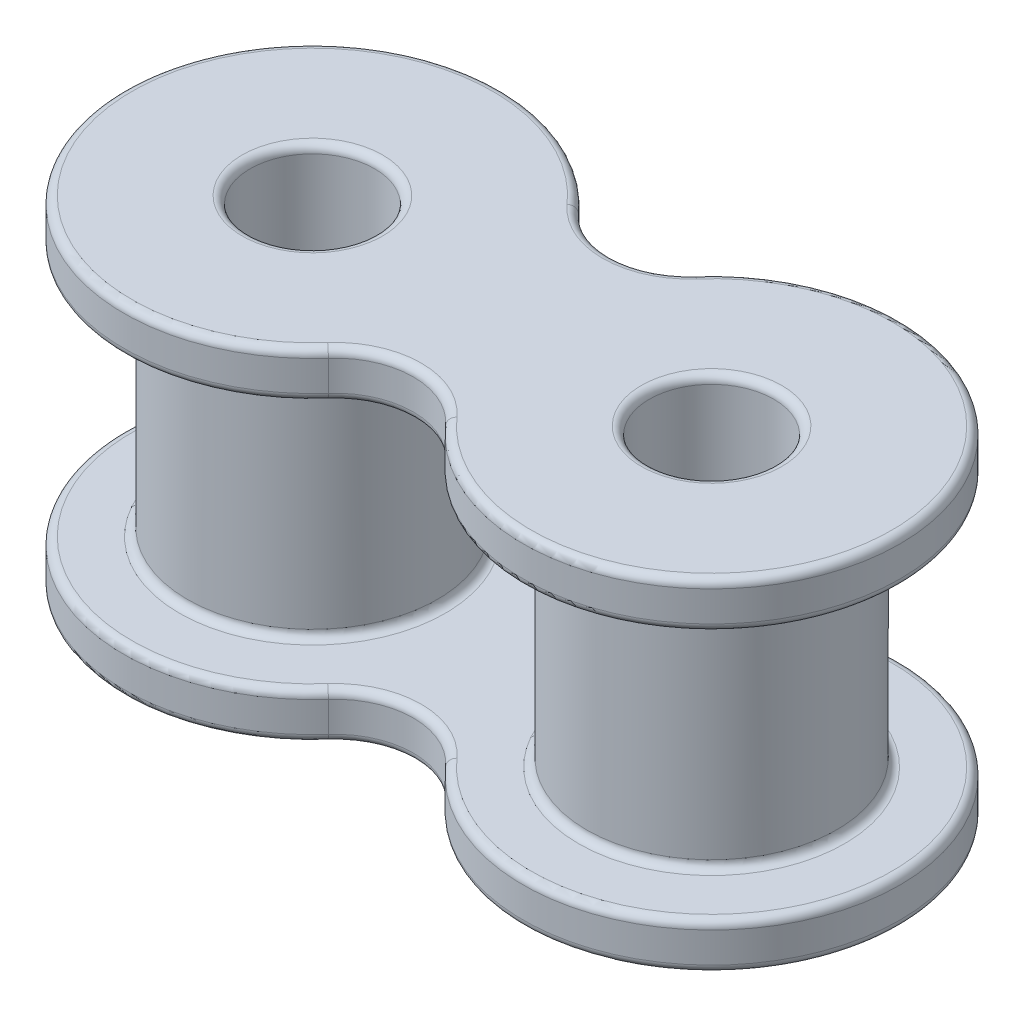
ISO-10303-21;
HEADER;
FILE_DESCRIPTION(('STEP AP214'),'2;1');
FILE_NAME('part.step','',(''),(''),'','','');
FILE_SCHEMA(('AUTOMOTIVE_DESIGN { 1 0 10303 214 1 1 1 1 }'));
ENDSEC;
DATA;
#1=APPLICATION_CONTEXT('core data for automotive mechanical design processes');
#2=APPLICATION_PROTOCOL_DEFINITION('international standard','automotive_design',2000,#1);
#3=PRODUCT_CONTEXT('',#1,'mechanical');
#4=PRODUCT('Part','Part','',(#3));
#5=PRODUCT_RELATED_PRODUCT_CATEGORY('part','',(#4));
#6=PRODUCT_DEFINITION_FORMATION('','',#4);
#7=PRODUCT_DEFINITION_CONTEXT('part definition',#1,'design');
#8=PRODUCT_DEFINITION('design','',#6,#7);
#9=PRODUCT_DEFINITION_SHAPE('','',#8);
#10=(LENGTH_UNIT() NAMED_UNIT(*) SI_UNIT(.MILLI.,.METRE.));
#11=(NAMED_UNIT(*) PLANE_ANGLE_UNIT() SI_UNIT($,.RADIAN.));
#12=(NAMED_UNIT(*) SI_UNIT($,.STERADIAN.) SOLID_ANGLE_UNIT());
#13=UNCERTAINTY_MEASURE_WITH_UNIT(LENGTH_MEASURE(1.E-05),#10,'distance_accuracy_value','');
#14=(GEOMETRIC_REPRESENTATION_CONTEXT(3) GLOBAL_UNCERTAINTY_ASSIGNED_CONTEXT((#13)) GLOBAL_UNIT_ASSIGNED_CONTEXT((#10,
#11,#12)) REPRESENTATION_CONTEXT('',''));
#15=CARTESIAN_POINT('',(0.,0.,0.));
#16=DIRECTION('',(0.,0.,1.));
#17=DIRECTION('',(1.,0.,0.));
#18=AXIS2_PLACEMENT_3D('',#15,#16,#17);
#19=CARTESIAN_POINT('',(3.175,0.7366,-2.81610900547326));
#20=DIRECTION('',(0.,1.,0.));
#21=DIRECTION('',(0.,0.,1.));
#22=AXIS2_PLACEMENT_3D('',#19,#20,#21);
#23=PLANE('',#22);
#24=CARTESIAN_POINT('',(-6.35,0.7366,0.));
#25=DIRECTION('',(0.,1.,0.));
#26=DIRECTION('',(0.,0.,1.));
#27=AXIS2_PLACEMENT_3D('',#24,#25,#26);
#28=CIRCLE('',#27,4.2291);
#29=CARTESIAN_POINT('',(-6.35,0.7366,4.2291));
#30=VERTEX_POINT('',#29);
#31=EDGE_CURVE('E183',#30,#30,#28,.F.);
#32=ORIENTED_EDGE('',*,*,#31,.T.);
#33=EDGE_LOOP('',(#32));
#34=FACE_BOUND('',#33,.T.);
#35=CARTESIAN_POINT('',(6.35,0.7366,0.));
#36=DIRECTION('',(0.,1.,0.));
#37=DIRECTION('',(0.,0.,1.));
#38=AXIS2_PLACEMENT_3D('',#35,#36,#37);
#39=CIRCLE('',#38,4.2291);
#40=CARTESIAN_POINT('',(6.35,0.7366,4.2291));
#41=VERTEX_POINT('',#40);
#42=EDGE_CURVE('E180',#41,#41,#39,.F.);
#43=ORIENTED_EDGE('',*,*,#42,.T.);
#44=EDGE_LOOP('',(#43));
#45=FACE_BOUND('',#44,.T.);
#46=CARTESIAN_POINT('',(6.35,0.7366,0.));
#47=DIRECTION('',(0.,1.,0.));
#48=DIRECTION('',(0.,0.,1.));
#49=AXIS2_PLACEMENT_3D('',#46,#47,#48);
#50=CIRCLE('',#49,5.7404);
#51=CARTESIAN_POINT('',(2.05546815225198,0.7366,3.80909285377477));
#52=VERTEX_POINT('',#51);
#53=CARTESIAN_POINT('',(2.05546815225198,0.7366,-3.80909285377477));
#54=VERTEX_POINT('',#53);
#55=EDGE_CURVE('E178',#52,#54,#50,.T.);
#56=ORIENTED_EDGE('',*,*,#55,.T.);
#57=CARTESIAN_POINT('',(0.,0.7366,-5.63221801094651));
#58=DIRECTION('',(0.,1.,0.));
#59=DIRECTION('',(0.,0.,1.));
#60=AXIS2_PLACEMENT_3D('',#57,#58,#59);
#61=CIRCLE('',#60,2.74749607163225);
#62=CARTESIAN_POINT('',(-2.05546815225198,0.7366,-3.80909285377477));
#63=VERTEX_POINT('',#62);
#64=EDGE_CURVE('E159',#54,#63,#61,.F.);
#65=ORIENTED_EDGE('',*,*,#64,.T.);
#66=CARTESIAN_POINT('',(-6.35,0.7366,0.));
#67=DIRECTION('',(0.,1.,0.));
#68=DIRECTION('',(0.,0.,1.));
#69=AXIS2_PLACEMENT_3D('',#66,#67,#68);
#70=CIRCLE('',#69,5.7404);
#71=CARTESIAN_POINT('',(-2.05546815225198,0.7366,3.80909285377477));
#72=VERTEX_POINT('',#71);
#73=EDGE_CURVE('E168',#63,#72,#70,.T.);
#74=ORIENTED_EDGE('',*,*,#73,.T.);
#75=CARTESIAN_POINT('',(0.,0.7366,5.63221801094651));
#76=DIRECTION('',(0.,1.,0.));
#77=DIRECTION('',(0.,0.,1.));
#78=AXIS2_PLACEMENT_3D('',#75,#76,#77);
#79=CIRCLE('',#78,2.74749607163225);
#80=EDGE_CURVE('E174',#72,#52,#79,.F.);
#81=ORIENTED_EDGE('',*,*,#80,.T.);
#82=EDGE_LOOP('',(#56,#65,#74,#81));
#83=FACE_BOUND('',#82,.T.);
#84=ADVANCED_FACE('F36',(#34,#45,#83),#23,.T.);
#85=CARTESIAN_POINT('',(3.175,-0.7366,-2.81610900547326));
#86=DIRECTION('',(0.,1.,0.));
#87=DIRECTION('',(0.,0.,1.));
#88=AXIS2_PLACEMENT_3D('',#85,#86,#87);
#89=PLANE('',#88);
#90=CARTESIAN_POINT('',(6.35,-0.7366,0.));
#91=DIRECTION('',(0.,1.,0.));
#92=DIRECTION('',(0.,0.,1.));
#93=AXIS2_PLACEMENT_3D('',#90,#91,#92);
#94=CIRCLE('',#93,2.2352);
#95=CARTESIAN_POINT('',(6.35,-0.7366,2.2352));
#96=VERTEX_POINT('',#95);
#97=EDGE_CURVE('E218',#96,#96,#94,.T.);
#98=ORIENTED_EDGE('',*,*,#97,.T.);
#99=EDGE_LOOP('',(#98));
#100=FACE_BOUND('',#99,.T.);
#101=CARTESIAN_POINT('',(-6.35,-0.7366,0.));
#102=DIRECTION('',(0.,1.,0.));
#103=DIRECTION('',(0.,0.,1.));
#104=AXIS2_PLACEMENT_3D('',#101,#102,#103);
#105=CIRCLE('',#104,2.2352);
#106=CARTESIAN_POINT('',(-6.35,-0.7366,2.2352));
#107=VERTEX_POINT('',#106);
#108=EDGE_CURVE('E215',#107,#107,#105,.T.);
#109=ORIENTED_EDGE('',*,*,#108,.T.);
#110=EDGE_LOOP('',(#109));
#111=FACE_BOUND('',#110,.T.);
#112=CARTESIAN_POINT('',(0.,-0.7366,5.63221801094651));
#113=DIRECTION('',(0.,1.,0.));
#114=DIRECTION('',(0.,0.,1.));
#115=AXIS2_PLACEMENT_3D('',#112,#113,#114);
#116=CIRCLE('',#115,2.74749607163225);
#117=CARTESIAN_POINT('',(2.05546815225198,-0.7366,3.80909285377476));
#118=VERTEX_POINT('',#117);
#119=CARTESIAN_POINT('',(-2.05546815225198,-0.7366,3.80909285377476));
#120=VERTEX_POINT('',#119);
#121=EDGE_CURVE('E208',#118,#120,#116,.T.);
#122=ORIENTED_EDGE('',*,*,#121,.T.);
#123=CARTESIAN_POINT('',(-6.35,-0.7366,0.));
#124=DIRECTION('',(0.,1.,0.));
#125=DIRECTION('',(0.,0.,1.));
#126=AXIS2_PLACEMENT_3D('',#123,#124,#125);
#127=CIRCLE('',#126,5.7404);
#128=CARTESIAN_POINT('',(-2.05546815225198,-0.7366,-3.80909285377477));
#129=VERTEX_POINT('',#128);
#130=EDGE_CURVE('E212',#120,#129,#127,.F.);
#131=ORIENTED_EDGE('',*,*,#130,.T.);
#132=CARTESIAN_POINT('',(0.,-0.7366,-5.63221801094651));
#133=DIRECTION('',(0.,1.,0.));
#134=DIRECTION('',(0.,0.,1.));
#135=AXIS2_PLACEMENT_3D('',#132,#133,#134);
#136=CIRCLE('',#135,2.74749607163225);
#137=CARTESIAN_POINT('',(2.05546815225198,-0.7366,-3.80909285377477));
#138=VERTEX_POINT('',#137);
#139=EDGE_CURVE('E210',#129,#138,#136,.T.);
#140=ORIENTED_EDGE('',*,*,#139,.T.);
#141=CARTESIAN_POINT('',(6.35,-0.7366,0.));
#142=DIRECTION('',(0.,1.,0.));
#143=DIRECTION('',(0.,0.,1.));
#144=AXIS2_PLACEMENT_3D('',#141,#142,#143);
#145=CIRCLE('',#144,5.7404);
#146=EDGE_CURVE('E206',#138,#118,#145,.F.);
#147=ORIENTED_EDGE('',*,*,#146,.T.);
#148=EDGE_LOOP('',(#122,#131,#140,#147));
#149=FACE_BOUND('',#148,.T.);
#150=ADVANCED_FACE('F386',(#100,#111,#149),#89,.F.);
#151=CARTESIAN_POINT('',(0.,0.7366,-5.63221801094651));
#152=DIRECTION('',(0.,-1.,0.));
#153=DIRECTION('',(0.,0.,-1.));
#154=AXIS2_PLACEMENT_3D('',#151,#152,#153);
#155=CYLINDRICAL_SURFACE('',#154,2.49349607163225);
#156=DIRECTION('',(0.,-1.,0.));
#157=VECTOR('',#156,1.);
#158=CARTESIAN_POINT('',(-1.86544461916579,0.7366,-3.97763678535772));
#159=LINE('',#158,#157);
#160=CARTESIAN_POINT('',(-1.86544461916579,0.4826,-3.97763678535772));
#161=VERTEX_POINT('',#160);
#162=CARTESIAN_POINT('',(-1.86544461916579,-0.4826,-3.97763678535772));
#163=VERTEX_POINT('',#162);
#164=EDGE_CURVE('E175',#161,#163,#159,.T.);
#165=ORIENTED_EDGE('',*,*,#164,.F.);
#166=CARTESIAN_POINT('',(0.,0.4826,-5.63221801094651));
#167=DIRECTION('',(0.,1.,0.));
#168=DIRECTION('',(0.,0.,1.));
#169=AXIS2_PLACEMENT_3D('',#166,#167,#168);
#170=CIRCLE('',#169,2.49349607163225);
#171=CARTESIAN_POINT('',(1.86544461916579,0.4826,-3.97763678535772));
#172=VERTEX_POINT('',#171);
#173=EDGE_CURVE('E161',#161,#172,#170,.T.);
#174=ORIENTED_EDGE('',*,*,#173,.T.);
#175=DIRECTION('',(0.,-1.,0.));
#176=VECTOR('',#175,1.);
#177=CARTESIAN_POINT('',(1.86544461916579,0.7366,-3.97763678535772));
#178=LINE('',#177,#176);
#179=CARTESIAN_POINT('',(1.86544461916579,-0.4826,-3.97763678535772));
#180=VERTEX_POINT('',#179);
#181=EDGE_CURVE('E239',#172,#180,#178,.T.);
#182=ORIENTED_EDGE('',*,*,#181,.T.);
#183=CARTESIAN_POINT('',(0.,-0.4826,-5.63221801094651));
#184=DIRECTION('',(0.,1.,0.));
#185=DIRECTION('',(0.,0.,1.));
#186=AXIS2_PLACEMENT_3D('',#183,#184,#185);
#187=CIRCLE('',#186,2.49349607163225);
#188=EDGE_CURVE('E190',#180,#163,#187,.F.);
#189=ORIENTED_EDGE('',*,*,#188,.T.);
#190=EDGE_LOOP('',(#165,#174,#182,#189));
#191=FACE_BOUND('',#190,.T.);
#192=ADVANCED_FACE('F370',(#191),#155,.F.);
#193=CARTESIAN_POINT('',(-6.35,0.7366,0.));
#194=DIRECTION('',(0.,-1.,0.));
#195=DIRECTION('',(0.,0.,-1.));
#196=AXIS2_PLACEMENT_3D('',#193,#194,#195);
#197=CYLINDRICAL_SURFACE('',#196,5.9944);
#198=ORIENTED_EDGE('',*,*,#164,.T.);
#199=CARTESIAN_POINT('',(-6.35,-0.4826,0.));
#200=DIRECTION('',(0.,1.,0.));
#201=DIRECTION('',(0.,0.,1.));
#202=AXIS2_PLACEMENT_3D('',#199,#200,#201);
#203=CIRCLE('',#202,5.9944);
#204=CARTESIAN_POINT('',(-1.86544461916578,-0.4826,3.97763678535772));
#205=VERTEX_POINT('',#204);
#206=EDGE_CURVE('E203',#163,#205,#203,.T.);
#207=ORIENTED_EDGE('',*,*,#206,.T.);
#208=DIRECTION('',(0.,-1.,0.));
#209=VECTOR('',#208,1.);
#210=CARTESIAN_POINT('',(-1.86544461916578,0.7366,3.97763678535772));
#211=LINE('',#210,#209);
#212=CARTESIAN_POINT('',(-1.86544461916578,0.4826,3.97763678535772));
#213=VERTEX_POINT('',#212);
#214=EDGE_CURVE('E354',#213,#205,#211,.T.);
#215=ORIENTED_EDGE('',*,*,#214,.F.);
#216=CARTESIAN_POINT('',(-6.35,0.4826,0.));
#217=DIRECTION('',(0.,1.,0.));
#218=DIRECTION('',(0.,0.,1.));
#219=AXIS2_PLACEMENT_3D('',#216,#217,#218);
#220=CIRCLE('',#219,5.9944);
#221=EDGE_CURVE('E201',#213,#161,#220,.F.);
#222=ORIENTED_EDGE('',*,*,#221,.T.);
#223=EDGE_LOOP('',(#198,#207,#215,#222));
#224=FACE_BOUND('',#223,.T.);
#225=ADVANCED_FACE('F395',(#224),#197,.T.);
#226=CARTESIAN_POINT('',(0.,0.7366,5.63221801094651));
#227=DIRECTION('',(0.,-1.,0.));
#228=DIRECTION('',(0.,0.,-1.));
#229=AXIS2_PLACEMENT_3D('',#226,#227,#228);
#230=CYLINDRICAL_SURFACE('',#229,2.49349607163225);
#231=DIRECTION('',(0.,-1.,0.));
#232=VECTOR('',#231,1.);
#233=CARTESIAN_POINT('',(1.86544461916579,0.7366,3.97763678535772));
#234=LINE('',#233,#232);
#235=CARTESIAN_POINT('',(1.86544461916579,0.4826,3.97763678535772));
#236=VERTEX_POINT('',#235);
#237=CARTESIAN_POINT('',(1.86544461916579,-0.4826,3.97763678535772));
#238=VERTEX_POINT('',#237);
#239=EDGE_CURVE('E351',#236,#238,#234,.T.);
#240=ORIENTED_EDGE('',*,*,#239,.F.);
#241=CARTESIAN_POINT('',(0.,0.4826,5.63221801094651));
#242=DIRECTION('',(0.,1.,0.));
#243=DIRECTION('',(0.,0.,1.));
#244=AXIS2_PLACEMENT_3D('',#241,#242,#243);
#245=CIRCLE('',#244,2.49349607163225);
#246=EDGE_CURVE('E199',#236,#213,#245,.T.);
#247=ORIENTED_EDGE('',*,*,#246,.T.);
#248=ORIENTED_EDGE('',*,*,#214,.T.);
#249=CARTESIAN_POINT('',(0.,-0.4826,5.63221801094651));
#250=DIRECTION('',(0.,1.,0.));
#251=DIRECTION('',(0.,0.,1.));
#252=AXIS2_PLACEMENT_3D('',#249,#250,#251);
#253=CIRCLE('',#252,2.49349607163225);
#254=EDGE_CURVE('E197',#205,#238,#253,.F.);
#255=ORIENTED_EDGE('',*,*,#254,.T.);
#256=EDGE_LOOP('',(#240,#247,#248,#255));
#257=FACE_BOUND('',#256,.T.);
#258=ADVANCED_FACE('F398',(#257),#230,.F.);
#259=CARTESIAN_POINT('',(6.35,0.7366,0.));
#260=DIRECTION('',(0.,-1.,0.));
#261=DIRECTION('',(0.,0.,-1.));
#262=AXIS2_PLACEMENT_3D('',#259,#260,#261);
#263=CYLINDRICAL_SURFACE('',#262,5.9944);
#264=ORIENTED_EDGE('',*,*,#181,.F.);
#265=CARTESIAN_POINT('',(6.35,0.4826,0.));
#266=DIRECTION('',(0.,1.,0.));
#267=DIRECTION('',(0.,0.,1.));
#268=AXIS2_PLACEMENT_3D('',#265,#266,#267);
#269=CIRCLE('',#268,5.9944);
#270=EDGE_CURVE('E195',#172,#236,#269,.F.);
#271=ORIENTED_EDGE('',*,*,#270,.T.);
#272=ORIENTED_EDGE('',*,*,#239,.T.);
#273=CARTESIAN_POINT('',(6.35,-0.4826,0.));
#274=DIRECTION('',(0.,1.,0.));
#275=DIRECTION('',(0.,0.,1.));
#276=AXIS2_PLACEMENT_3D('',#273,#274,#275);
#277=CIRCLE('',#276,5.9944);
#278=EDGE_CURVE('E193',#238,#180,#277,.T.);
#279=ORIENTED_EDGE('',*,*,#278,.T.);
#280=EDGE_LOOP('',(#264,#271,#272,#279));
#281=FACE_BOUND('',#280,.T.);
#282=ADVANCED_FACE('F372',(#281),#263,.T.);
#283=CARTESIAN_POINT('',(-6.35,0.7366,0.));
#284=DIRECTION('',(0.,-1.,0.));
#285=DIRECTION('',(0.,0.,-1.));
#286=AXIS2_PLACEMENT_3D('',#283,#284,#285);
#287=CYLINDRICAL_SURFACE('',#286,1.9812);
#288=CARTESIAN_POINT('',(-6.35,9.8806,0.));
#289=DIRECTION('',(0.,-1.,0.));
#290=DIRECTION('',(0.,0.,-1.));
#291=AXIS2_PLACEMENT_3D('',#288,#289,#290);
#292=CIRCLE('',#291,1.9812);
#293=CARTESIAN_POINT('',(-6.35,9.8806,-1.9812));
#294=VERTEX_POINT('',#293);
#295=EDGE_CURVE('E11',#294,#294,#292,.F.);
#296=ORIENTED_EDGE('',*,*,#295,.T.);
#297=EDGE_LOOP('',(#296));
#298=FACE_BOUND('',#297,.T.);
#299=CARTESIAN_POINT('',(-6.35,-0.4826,0.));
#300=DIRECTION('',(0.,1.,0.));
#301=DIRECTION('',(0.,0.,1.));
#302=AXIS2_PLACEMENT_3D('',#299,#300,#301);
#303=CIRCLE('',#302,1.9812);
#304=CARTESIAN_POINT('',(-6.35,-0.4826,1.9812));
#305=VERTEX_POINT('',#304);
#306=EDGE_CURVE('E230',#305,#305,#303,.F.);
#307=ORIENTED_EDGE('',*,*,#306,.T.);
#308=EDGE_LOOP('',(#307));
#309=FACE_BOUND('',#308,.T.);
#310=ADVANCED_FACE('F405',(#298,#309),#287,.F.);
#311=CARTESIAN_POINT('',(6.35,0.7366,0.));
#312=DIRECTION('',(0.,-1.,0.));
#313=DIRECTION('',(0.,0.,-1.));
#314=AXIS2_PLACEMENT_3D('',#311,#312,#313);
#315=CYLINDRICAL_SURFACE('',#314,1.9812);
#316=CARTESIAN_POINT('',(6.35,9.8806,0.));
#317=DIRECTION('',(0.,-1.,0.));
#318=DIRECTION('',(0.,0.,-1.));
#319=AXIS2_PLACEMENT_3D('',#316,#317,#318);
#320=CIRCLE('',#319,1.9812);
#321=CARTESIAN_POINT('',(6.35,9.8806,-1.9812));
#322=VERTEX_POINT('',#321);
#323=EDGE_CURVE('E45',#322,#322,#320,.F.);
#324=ORIENTED_EDGE('',*,*,#323,.T.);
#325=EDGE_LOOP('',(#324));
#326=FACE_BOUND('',#325,.T.);
#327=CARTESIAN_POINT('',(6.35,-0.4826,0.));
#328=DIRECTION('',(0.,1.,0.));
#329=DIRECTION('',(0.,0.,1.));
#330=AXIS2_PLACEMENT_3D('',#327,#328,#329);
#331=CIRCLE('',#330,1.9812);
#332=CARTESIAN_POINT('',(6.35,-0.4826,1.9812));
#333=VERTEX_POINT('',#332);
#334=EDGE_CURVE('E227',#333,#333,#331,.F.);
#335=ORIENTED_EDGE('',*,*,#334,.T.);
#336=EDGE_LOOP('',(#335));
#337=FACE_BOUND('',#336,.T.);
#338=ADVANCED_FACE('F420',(#326,#337),#315,.F.);
#339=CARTESIAN_POINT('',(6.35,8.6614,0.));
#340=DIRECTION('',(0.,-1.,0.));
#341=DIRECTION('',(0.,0.,-1.));
#342=AXIS2_PLACEMENT_3D('',#339,#340,#341);
#343=CYLINDRICAL_SURFACE('',#342,3.9751);
#344=CARTESIAN_POINT('',(6.35,8.4074,0.));
#345=DIRECTION('',(0.,-1.,0.));
#346=DIRECTION('',(0.,0.,-1.));
#347=AXIS2_PLACEMENT_3D('',#344,#345,#346);
#348=CIRCLE('',#347,3.9751);
#349=CARTESIAN_POINT('',(6.35,8.4074,-3.9751));
#350=VERTEX_POINT('',#349);
#351=EDGE_CURVE('E298',#350,#350,#348,.T.);
#352=ORIENTED_EDGE('',*,*,#351,.T.);
#353=EDGE_LOOP('',(#352));
#354=FACE_BOUND('',#353,.T.);
#355=CARTESIAN_POINT('',(6.35,0.990599999999999,0.));
#356=DIRECTION('',(0.,1.,0.));
#357=DIRECTION('',(0.,0.,1.));
#358=AXIS2_PLACEMENT_3D('',#355,#356,#357);
#359=CIRCLE('',#358,3.9751);
#360=CARTESIAN_POINT('',(6.35,0.990599999999999,3.9751));
#361=VERTEX_POINT('',#360);
#362=EDGE_CURVE('E224',#361,#361,#359,.T.);
#363=ORIENTED_EDGE('',*,*,#362,.T.);
#364=EDGE_LOOP('',(#363));
#365=FACE_BOUND('',#364,.T.);
#366=ADVANCED_FACE('F424',(#354,#365),#343,.T.);
#367=CARTESIAN_POINT('',(-6.35,8.6614,0.));
#368=DIRECTION('',(0.,-1.,0.));
#369=DIRECTION('',(0.,0.,-1.));
#370=AXIS2_PLACEMENT_3D('',#367,#368,#369);
#371=CYLINDRICAL_SURFACE('',#370,3.9751);
#372=CARTESIAN_POINT('',(-6.35,8.4074,0.));
#373=DIRECTION('',(0.,-1.,0.));
#374=DIRECTION('',(0.,0.,-1.));
#375=AXIS2_PLACEMENT_3D('',#372,#373,#374);
#376=CIRCLE('',#375,3.9751);
#377=CARTESIAN_POINT('',(-6.35,8.4074,-3.9751));
#378=VERTEX_POINT('',#377);
#379=EDGE_CURVE('E295',#378,#378,#376,.T.);
#380=ORIENTED_EDGE('',*,*,#379,.T.);
#381=EDGE_LOOP('',(#380));
#382=FACE_BOUND('',#381,.T.);
#383=CARTESIAN_POINT('',(-6.35,0.990599999999999,0.));
#384=DIRECTION('',(0.,1.,0.));
#385=DIRECTION('',(0.,0.,1.));
#386=AXIS2_PLACEMENT_3D('',#383,#384,#385);
#387=CIRCLE('',#386,3.9751);
#388=CARTESIAN_POINT('',(-6.35,0.990599999999999,3.9751));
#389=VERTEX_POINT('',#388);
#390=EDGE_CURVE('E221',#389,#389,#387,.T.);
#391=ORIENTED_EDGE('',*,*,#390,.T.);
#392=EDGE_LOOP('',(#391));
#393=FACE_BOUND('',#392,.T.);
#394=ADVANCED_FACE('F428',(#382,#393),#371,.T.);
#395=CARTESIAN_POINT('',(0.,0.4826,5.63221801094651));
#396=DIRECTION('',(0.,1.,0.));
#397=DIRECTION('',(0.,0.,1.));
#398=AXIS2_PLACEMENT_3D('',#395,#396,#397);
#399=TOROIDAL_SURFACE('',#398,2.74749607163225,0.254);
#400=CARTESIAN_POINT('',(-2.05546815225198,0.4826,3.80909285377476));
#401=DIRECTION('',(-0.663558785759664,0.,0.748124146008642));
#402=DIRECTION('',(0.748124146008642,0.,0.663558785759664));
#403=AXIS2_PLACEMENT_3D('',#400,#401,#402);
#404=CIRCLE('',#403,0.254);
#405=EDGE_CURVE('E171',#213,#72,#404,.T.);
#406=ORIENTED_EDGE('',*,*,#405,.F.);
#407=ORIENTED_EDGE('',*,*,#246,.F.);
#408=CARTESIAN_POINT('',(2.05546815225198,0.4826,3.80909285377477));
#409=DIRECTION('',(0.663558785759662,0.,0.748124146008644));
#410=DIRECTION('',(0.748124146008644,0.,-0.663558785759662));
#411=AXIS2_PLACEMENT_3D('',#408,#409,#410);
#412=CIRCLE('',#411,0.254);
#413=EDGE_CURVE('E236',#52,#236,#412,.T.);
#414=ORIENTED_EDGE('',*,*,#413,.F.);
#415=ORIENTED_EDGE('',*,*,#80,.F.);
#416=EDGE_LOOP('',(#406,#407,#414,#415));
#417=FACE_BOUND('',#416,.T.);
#418=ADVANCED_FACE('F361',(#417),#399,.T.);
#419=CARTESIAN_POINT('',(6.35,0.4826,0.));
#420=DIRECTION('',(0.,1.,0.));
#421=DIRECTION('',(0.,0.,1.));
#422=AXIS2_PLACEMENT_3D('',#419,#420,#421);
#423=TOROIDAL_SURFACE('',#422,5.7404,0.254);
#424=ORIENTED_EDGE('',*,*,#413,.T.);
#425=ORIENTED_EDGE('',*,*,#270,.F.);
#426=CARTESIAN_POINT('',(2.05546815225198,0.4826,-3.80909285377477));
#427=DIRECTION('',(-0.663558785759663,0.,0.748124146008643));
#428=DIRECTION('',(0.748124146008643,0.,0.663558785759663));
#429=AXIS2_PLACEMENT_3D('',#426,#427,#428);
#430=CIRCLE('',#429,0.254);
#431=EDGE_CURVE('E164',#54,#172,#430,.T.);
#432=ORIENTED_EDGE('',*,*,#431,.F.);
#433=ORIENTED_EDGE('',*,*,#55,.F.);
#434=EDGE_LOOP('',(#424,#425,#432,#433));
#435=FACE_BOUND('',#434,.T.);
#436=ADVANCED_FACE('F364',(#435),#423,.T.);
#437=CARTESIAN_POINT('',(-6.35,0.4826,0.));
#438=DIRECTION('',(0.,1.,0.));
#439=DIRECTION('',(0.,0.,1.));
#440=AXIS2_PLACEMENT_3D('',#437,#438,#439);
#441=TOROIDAL_SURFACE('',#440,5.7404,0.254);
#442=ORIENTED_EDGE('',*,*,#405,.T.);
#443=ORIENTED_EDGE('',*,*,#73,.F.);
#444=CARTESIAN_POINT('',(-2.05546815225198,0.4826,-3.80909285377477));
#445=DIRECTION('',(0.663558785759663,0.,0.748124146008643));
#446=DIRECTION('',(0.748124146008643,0.,-0.663558785759663));
#447=AXIS2_PLACEMENT_3D('',#444,#445,#446);
#448=CIRCLE('',#447,0.254);
#449=EDGE_CURVE('E155',#161,#63,#448,.T.);
#450=ORIENTED_EDGE('',*,*,#449,.F.);
#451=ORIENTED_EDGE('',*,*,#221,.F.);
#452=EDGE_LOOP('',(#442,#443,#450,#451));
#453=FACE_BOUND('',#452,.T.);
#454=ADVANCED_FACE('F169',(#453),#441,.T.);
#455=CARTESIAN_POINT('',(0.,0.4826,-5.63221801094651));
#456=DIRECTION('',(0.,1.,0.));
#457=DIRECTION('',(0.,0.,1.));
#458=AXIS2_PLACEMENT_3D('',#455,#456,#457);
#459=TOROIDAL_SURFACE('',#458,2.74749607163225,0.254);
#460=ORIENTED_EDGE('',*,*,#431,.T.);
#461=ORIENTED_EDGE('',*,*,#173,.F.);
#462=ORIENTED_EDGE('',*,*,#449,.T.);
#463=ORIENTED_EDGE('',*,*,#64,.F.);
#464=EDGE_LOOP('',(#460,#461,#462,#463));
#465=FACE_BOUND('',#464,.T.);
#466=ADVANCED_FACE('F157',(#465),#459,.T.);
#467=CARTESIAN_POINT('',(6.35,-0.4826,0.));
#468=DIRECTION('',(0.,1.,0.));
#469=DIRECTION('',(0.,0.,1.));
#470=AXIS2_PLACEMENT_3D('',#467,#468,#469);
#471=TOROIDAL_SURFACE('',#470,5.7404,0.254);
#472=CARTESIAN_POINT('',(2.05546815225198,-0.4826,3.80909285377476));
#473=DIRECTION('',(-0.663558785759664,0.,-0.748124146008643));
#474=DIRECTION('',(-0.748124146008643,0.,0.663558785759664));
#475=AXIS2_PLACEMENT_3D('',#472,#473,#474);
#476=CIRCLE('',#475,0.254);
#477=EDGE_CURVE('E245',#118,#238,#476,.T.);
#478=ORIENTED_EDGE('',*,*,#477,.F.);
#479=ORIENTED_EDGE('',*,*,#146,.F.);
#480=CARTESIAN_POINT('',(2.05546815225198,-0.4826,-3.80909285377477));
#481=DIRECTION('',(-0.663558785759662,0.,0.748124146008644));
#482=DIRECTION('',(0.748124146008644,0.,0.663558785759662));
#483=AXIS2_PLACEMENT_3D('',#480,#481,#482);
#484=CIRCLE('',#483,0.254);
#485=EDGE_CURVE('E165',#180,#138,#484,.T.);
#486=ORIENTED_EDGE('',*,*,#485,.F.);
#487=ORIENTED_EDGE('',*,*,#278,.F.);
#488=EDGE_LOOP('',(#478,#479,#486,#487));
#489=FACE_BOUND('',#488,.T.);
#490=ADVANCED_FACE('F376',(#489),#471,.T.);
#491=CARTESIAN_POINT('',(0.,-0.4826,-5.63221801094651));
#492=DIRECTION('',(0.,1.,0.));
#493=DIRECTION('',(0.,0.,1.));
#494=AXIS2_PLACEMENT_3D('',#491,#492,#493);
#495=TOROIDAL_SURFACE('',#494,2.74749607163225,0.254);
#496=ORIENTED_EDGE('',*,*,#485,.T.);
#497=ORIENTED_EDGE('',*,*,#139,.F.);
#498=CARTESIAN_POINT('',(-2.05546815225198,-0.4826,-3.80909285377477));
#499=DIRECTION('',(-0.663558785759663,0.,-0.748124146008643));
#500=DIRECTION('',(-0.748124146008643,0.,0.663558785759663));
#501=AXIS2_PLACEMENT_3D('',#498,#499,#500);
#502=CIRCLE('',#501,0.254);
#503=EDGE_CURVE('E242',#163,#129,#502,.T.);
#504=ORIENTED_EDGE('',*,*,#503,.F.);
#505=ORIENTED_EDGE('',*,*,#188,.F.);
#506=EDGE_LOOP('',(#496,#497,#504,#505));
#507=FACE_BOUND('',#506,.T.);
#508=ADVANCED_FACE('F393',(#507),#495,.T.);
#509=CARTESIAN_POINT('',(0.,-0.4826,5.63221801094651));
#510=DIRECTION('',(0.,1.,0.));
#511=DIRECTION('',(0.,0.,1.));
#512=AXIS2_PLACEMENT_3D('',#509,#510,#511);
#513=TOROIDAL_SURFACE('',#512,2.74749607163225,0.254);
#514=ORIENTED_EDGE('',*,*,#477,.T.);
#515=ORIENTED_EDGE('',*,*,#254,.F.);
#516=CARTESIAN_POINT('',(-2.05546815225198,-0.4826,3.80909285377476));
#517=DIRECTION('',(-0.663558785759662,0.,0.748124146008644));
#518=DIRECTION('',(0.748124146008644,0.,0.663558785759662));
#519=AXIS2_PLACEMENT_3D('',#516,#517,#518);
#520=CIRCLE('',#519,0.254);
#521=EDGE_CURVE('E240',#120,#205,#520,.T.);
#522=ORIENTED_EDGE('',*,*,#521,.F.);
#523=ORIENTED_EDGE('',*,*,#121,.F.);
#524=EDGE_LOOP('',(#514,#515,#522,#523));
#525=FACE_BOUND('',#524,.T.);
#526=ADVANCED_FACE('F382',(#525),#513,.T.);
#527=CARTESIAN_POINT('',(-6.35,-0.4826,0.));
#528=DIRECTION('',(0.,1.,0.));
#529=DIRECTION('',(0.,0.,1.));
#530=AXIS2_PLACEMENT_3D('',#527,#528,#529);
#531=TOROIDAL_SURFACE('',#530,5.7404,0.254);
#532=ORIENTED_EDGE('',*,*,#503,.T.);
#533=ORIENTED_EDGE('',*,*,#130,.F.);
#534=ORIENTED_EDGE('',*,*,#521,.T.);
#535=ORIENTED_EDGE('',*,*,#206,.F.);
#536=EDGE_LOOP('',(#532,#533,#534,#535));
#537=FACE_BOUND('',#536,.T.);
#538=ADVANCED_FACE('F388',(#537),#531,.T.);
#539=CARTESIAN_POINT('',(-6.35,0.990599999999999,0.));
#540=DIRECTION('',(0.,1.,0.));
#541=DIRECTION('',(0.,0.,1.));
#542=AXIS2_PLACEMENT_3D('',#539,#540,#541);
#543=TOROIDAL_SURFACE('',#542,4.2291,0.254);
#544=ORIENTED_EDGE('',*,*,#31,.F.);
#545=EDGE_LOOP('',(#544));
#546=FACE_BOUND('',#545,.T.);
#547=ORIENTED_EDGE('',*,*,#390,.F.);
#548=EDGE_LOOP('',(#547));
#549=FACE_BOUND('',#548,.T.);
#550=ADVANCED_FACE('F671',(#546,#549),#543,.F.);
#551=CARTESIAN_POINT('',(6.35,0.990599999999999,0.));
#552=DIRECTION('',(0.,1.,0.));
#553=DIRECTION('',(0.,0.,1.));
#554=AXIS2_PLACEMENT_3D('',#551,#552,#553);
#555=TOROIDAL_SURFACE('',#554,4.2291,0.254);
#556=ORIENTED_EDGE('',*,*,#42,.F.);
#557=EDGE_LOOP('',(#556));
#558=FACE_BOUND('',#557,.T.);
#559=ORIENTED_EDGE('',*,*,#362,.F.);
#560=EDGE_LOOP('',(#559));
#561=FACE_BOUND('',#560,.T.);
#562=ADVANCED_FACE('F512',(#558,#561),#555,.F.);
#563=CARTESIAN_POINT('',(6.35,-0.4826,0.));
#564=DIRECTION('',(0.,1.,0.));
#565=DIRECTION('',(0.,0.,1.));
#566=AXIS2_PLACEMENT_3D('',#563,#564,#565);
#567=TOROIDAL_SURFACE('',#566,2.2352,0.254);
#568=ORIENTED_EDGE('',*,*,#334,.F.);
#569=EDGE_LOOP('',(#568));
#570=FACE_BOUND('',#569,.T.);
#571=ORIENTED_EDGE('',*,*,#97,.F.);
#572=EDGE_LOOP('',(#571));
#573=FACE_BOUND('',#572,.T.);
#574=ADVANCED_FACE('F509',(#570,#573),#567,.T.);
#575=CARTESIAN_POINT('',(-6.35,-0.4826,0.));
#576=DIRECTION('',(0.,1.,0.));
#577=DIRECTION('',(0.,0.,1.));
#578=AXIS2_PLACEMENT_3D('',#575,#576,#577);
#579=TOROIDAL_SURFACE('',#578,2.2352,0.254);
#580=ORIENTED_EDGE('',*,*,#306,.F.);
#581=EDGE_LOOP('',(#580));
#582=FACE_BOUND('',#581,.T.);
#583=ORIENTED_EDGE('',*,*,#108,.F.);
#584=EDGE_LOOP('',(#583));
#585=FACE_BOUND('',#584,.T.);
#586=ADVANCED_FACE('F436',(#582,#585),#579,.T.);
#587=CARTESIAN_POINT('',(0.,8.6614,-5.63221801094651));
#588=DIRECTION('',(0.,1.,0.));
#589=DIRECTION('',(0.,0.,1.));
#590=AXIS2_PLACEMENT_3D('',#587,#588,#589);
#591=CYLINDRICAL_SURFACE('',#590,2.49349607163225);
#592=DIRECTION('',(0.,1.,0.));
#593=VECTOR('',#592,1.);
#594=CARTESIAN_POINT('',(1.86544461916579,8.6614,-3.97763678535772));
#595=LINE('',#594,#593);
#596=CARTESIAN_POINT('',(1.86544461916579,8.9154,-3.97763678535772));
#597=VERTEX_POINT('',#596);
#598=CARTESIAN_POINT('',(1.86544461916579,9.8806,-3.97763678535772));
#599=VERTEX_POINT('',#598);
#600=EDGE_CURVE('E243',#597,#599,#595,.T.);
#601=ORIENTED_EDGE('',*,*,#600,.F.);
#602=CARTESIAN_POINT('',(0.,8.9154,-5.63221801094651));
#603=DIRECTION('',(0.,-1.,0.));
#604=DIRECTION('',(0.,0.,-1.));
#605=AXIS2_PLACEMENT_3D('',#602,#603,#604);
#606=CIRCLE('',#605,2.49349607163225);
#607=CARTESIAN_POINT('',(-1.86544461916579,8.9154,-3.97763678535772));
#608=VERTEX_POINT('',#607);
#609=EDGE_CURVE('E251',#597,#608,#606,.T.);
#610=ORIENTED_EDGE('',*,*,#609,.T.);
#611=DIRECTION('',(0.,1.,0.));
#612=VECTOR('',#611,1.);
#613=CARTESIAN_POINT('',(-1.86544461916579,8.6614,-3.97763678535772));
#614=LINE('',#613,#612);
#615=CARTESIAN_POINT('',(-1.86544461916579,9.8806,-3.97763678535772));
#616=VERTEX_POINT('',#615);
#617=EDGE_CURVE('E313',#608,#616,#614,.T.);
#618=ORIENTED_EDGE('',*,*,#617,.T.);
#619=CARTESIAN_POINT('',(0.,9.8806,-5.63221801094651));
#620=DIRECTION('',(0.,-1.,0.));
#621=DIRECTION('',(0.,0.,-1.));
#622=AXIS2_PLACEMENT_3D('',#619,#620,#621);
#623=CIRCLE('',#622,2.49349607163225);
#624=EDGE_CURVE('E232',#616,#599,#623,.F.);
#625=ORIENTED_EDGE('',*,*,#624,.T.);
#626=EDGE_LOOP('',(#601,#610,#618,#625));
#627=FACE_BOUND('',#626,.T.);
#628=ADVANCED_FACE('F433',(#627),#591,.F.);
#629=CARTESIAN_POINT('',(6.35,8.6614,0.));
#630=DIRECTION('',(0.,1.,0.));
#631=DIRECTION('',(0.,0.,1.));
#632=AXIS2_PLACEMENT_3D('',#629,#630,#631);
#633=CYLINDRICAL_SURFACE('',#632,5.9944);
#634=DIRECTION('',(0.,1.,0.));
#635=VECTOR('',#634,1.);
#636=CARTESIAN_POINT('',(1.86544461916579,8.6614,3.97763678535772));
#637=LINE('',#636,#635);
#638=CARTESIAN_POINT('',(1.86544461916579,8.9154,3.97763678535772));
#639=VERTEX_POINT('',#638);
#640=CARTESIAN_POINT('',(1.86544461916579,9.8806,3.97763678535772));
#641=VERTEX_POINT('',#640);
#642=EDGE_CURVE('E335',#639,#641,#637,.T.);
#643=ORIENTED_EDGE('',*,*,#642,.F.);
#644=CARTESIAN_POINT('',(6.35,8.9154,0.));
#645=DIRECTION('',(0.,-1.,0.));
#646=DIRECTION('',(0.,0.,-1.));
#647=AXIS2_PLACEMENT_3D('',#644,#645,#646);
#648=CIRCLE('',#647,5.9944);
#649=EDGE_CURVE('E271',#639,#597,#648,.F.);
#650=ORIENTED_EDGE('',*,*,#649,.T.);
#651=ORIENTED_EDGE('',*,*,#600,.T.);
#652=CARTESIAN_POINT('',(6.35,9.8806,0.));
#653=DIRECTION('',(0.,-1.,0.));
#654=DIRECTION('',(0.,0.,-1.));
#655=AXIS2_PLACEMENT_3D('',#652,#653,#654);
#656=CIRCLE('',#655,5.9944);
#657=EDGE_CURVE('E269',#599,#641,#656,.T.);
#658=ORIENTED_EDGE('',*,*,#657,.T.);
#659=EDGE_LOOP('',(#643,#650,#651,#658));
#660=FACE_BOUND('',#659,.T.);
#661=ADVANCED_FACE('F334',(#660),#633,.T.);
#662=CARTESIAN_POINT('',(0.,8.6614,5.63221801094651));
#663=DIRECTION('',(0.,1.,0.));
#664=DIRECTION('',(0.,0.,1.));
#665=AXIS2_PLACEMENT_3D('',#662,#663,#664);
#666=CYLINDRICAL_SURFACE('',#665,2.49349607163225);
#667=DIRECTION('',(0.,1.,0.));
#668=VECTOR('',#667,1.);
#669=CARTESIAN_POINT('',(-1.86544461916578,8.6614,3.97763678535772));
#670=LINE('',#669,#668);
#671=CARTESIAN_POINT('',(-1.86544461916578,8.9154,3.97763678535772));
#672=VERTEX_POINT('',#671);
#673=CARTESIAN_POINT('',(-1.86544461916578,9.8806,3.97763678535772));
#674=VERTEX_POINT('',#673);
#675=EDGE_CURVE('E343',#672,#674,#670,.T.);
#676=ORIENTED_EDGE('',*,*,#675,.F.);
#677=CARTESIAN_POINT('',(0.,8.9154,5.63221801094651));
#678=DIRECTION('',(0.,-1.,0.));
#679=DIRECTION('',(0.,0.,-1.));
#680=AXIS2_PLACEMENT_3D('',#677,#678,#679);
#681=CIRCLE('',#680,2.49349607163225);
#682=EDGE_CURVE('E275',#672,#639,#681,.T.);
#683=ORIENTED_EDGE('',*,*,#682,.T.);
#684=ORIENTED_EDGE('',*,*,#642,.T.);
#685=CARTESIAN_POINT('',(0.,9.8806,5.63221801094651));
#686=DIRECTION('',(0.,-1.,0.));
#687=DIRECTION('',(0.,0.,-1.));
#688=AXIS2_PLACEMENT_3D('',#685,#686,#687);
#689=CIRCLE('',#688,2.49349607163225);
#690=EDGE_CURVE('E273',#641,#674,#689,.F.);
#691=ORIENTED_EDGE('',*,*,#690,.T.);
#692=EDGE_LOOP('',(#676,#683,#684,#691));
#693=FACE_BOUND('',#692,.T.);
#694=ADVANCED_FACE('F340',(#693),#666,.F.);
#695=CARTESIAN_POINT('',(-6.35,8.6614,0.));
#696=DIRECTION('',(0.,1.,0.));
#697=DIRECTION('',(0.,0.,1.));
#698=AXIS2_PLACEMENT_3D('',#695,#696,#697);
#699=CYLINDRICAL_SURFACE('',#698,5.9944);
#700=ORIENTED_EDGE('',*,*,#675,.T.);
#701=CARTESIAN_POINT('',(-6.35,9.8806,0.));
#702=DIRECTION('',(0.,-1.,0.));
#703=DIRECTION('',(0.,0.,-1.));
#704=AXIS2_PLACEMENT_3D('',#701,#702,#703);
#705=CIRCLE('',#704,5.9944);
#706=EDGE_CURVE('E292',#674,#616,#705,.T.);
#707=ORIENTED_EDGE('',*,*,#706,.T.);
#708=ORIENTED_EDGE('',*,*,#617,.F.);
#709=CARTESIAN_POINT('',(-6.35,8.9154,0.));
#710=DIRECTION('',(0.,-1.,0.));
#711=DIRECTION('',(0.,0.,-1.));
#712=AXIS2_PLACEMENT_3D('',#709,#710,#711);
#713=CIRCLE('',#712,5.9944);
#714=EDGE_CURVE('E290',#608,#672,#713,.F.);
#715=ORIENTED_EDGE('',*,*,#714,.T.);
#716=EDGE_LOOP('',(#700,#707,#708,#715));
#717=FACE_BOUND('',#716,.T.);
#718=ADVANCED_FACE('F442',(#717),#699,.T.);
#719=CARTESIAN_POINT('',(3.175,8.6614,-2.81610900547326));
#720=DIRECTION('',(0.,-1.,0.));
#721=DIRECTION('',(0.,0.,1.));
#722=AXIS2_PLACEMENT_3D('',#719,#720,#721);
#723=PLANE('',#722);
#724=CARTESIAN_POINT('',(-6.35,8.6614,0.));
#725=DIRECTION('',(0.,-1.,0.));
#726=DIRECTION('',(0.,0.,-1.));
#727=AXIS2_PLACEMENT_3D('',#724,#725,#726);
#728=CIRCLE('',#727,4.2291);
#729=CARTESIAN_POINT('',(-6.35,8.6614,-4.2291));
#730=VERTEX_POINT('',#729);
#731=EDGE_CURVE('E266',#730,#730,#728,.F.);
#732=ORIENTED_EDGE('',*,*,#731,.T.);
#733=EDGE_LOOP('',(#732));
#734=FACE_BOUND('',#733,.T.);
#735=CARTESIAN_POINT('',(6.35,8.6614,0.));
#736=DIRECTION('',(0.,-1.,0.));
#737=DIRECTION('',(0.,0.,-1.));
#738=AXIS2_PLACEMENT_3D('',#735,#736,#737);
#739=CIRCLE('',#738,4.2291);
#740=CARTESIAN_POINT('',(6.35,8.6614,-4.2291));
#741=VERTEX_POINT('',#740);
#742=EDGE_CURVE('E263',#741,#741,#739,.F.);
#743=ORIENTED_EDGE('',*,*,#742,.T.);
#744=EDGE_LOOP('',(#743));
#745=FACE_BOUND('',#744,.T.);
#746=CARTESIAN_POINT('',(-6.35,8.6614,0.));
#747=DIRECTION('',(0.,-1.,0.));
#748=DIRECTION('',(0.,0.,-1.));
#749=AXIS2_PLACEMENT_3D('',#746,#747,#748);
#750=CIRCLE('',#749,5.7404);
#751=CARTESIAN_POINT('',(-2.05546815225198,8.6614,3.80909285377476));
#752=VERTEX_POINT('',#751);
#753=CARTESIAN_POINT('',(-2.05546815225198,8.6614,-3.80909285377477));
#754=VERTEX_POINT('',#753);
#755=EDGE_CURVE('E254',#752,#754,#750,.T.);
#756=ORIENTED_EDGE('',*,*,#755,.T.);
#757=CARTESIAN_POINT('',(0.,8.6614,-5.63221801094651));
#758=DIRECTION('',(0.,-1.,0.));
#759=DIRECTION('',(0.,0.,-1.));
#760=AXIS2_PLACEMENT_3D('',#757,#758,#759);
#761=CIRCLE('',#760,2.74749607163225);
#762=CARTESIAN_POINT('',(2.05546815225198,8.6614,-3.80909285377477));
#763=VERTEX_POINT('',#762);
#764=EDGE_CURVE('E260',#754,#763,#761,.F.);
#765=ORIENTED_EDGE('',*,*,#764,.T.);
#766=CARTESIAN_POINT('',(6.35,8.6614,0.));
#767=DIRECTION('',(0.,-1.,0.));
#768=DIRECTION('',(0.,0.,-1.));
#769=AXIS2_PLACEMENT_3D('',#766,#767,#768);
#770=CIRCLE('',#769,5.7404);
#771=CARTESIAN_POINT('',(2.05546815225198,8.6614,3.80909285377477));
#772=VERTEX_POINT('',#771);
#773=EDGE_CURVE('E258',#763,#772,#770,.T.);
#774=ORIENTED_EDGE('',*,*,#773,.T.);
#775=CARTESIAN_POINT('',(0.,8.6614,5.63221801094651));
#776=DIRECTION('',(0.,-1.,0.));
#777=DIRECTION('',(0.,0.,-1.));
#778=AXIS2_PLACEMENT_3D('',#775,#776,#777);
#779=CIRCLE('',#778,2.74749607163225);
#780=EDGE_CURVE('E256',#772,#752,#779,.F.);
#781=ORIENTED_EDGE('',*,*,#780,.T.);
#782=EDGE_LOOP('',(#756,#765,#774,#781));
#783=FACE_BOUND('',#782,.T.);
#784=ADVANCED_FACE('F445',(#734,#745,#783),#723,.T.);
#785=CARTESIAN_POINT('',(3.175,10.1346,-2.81610900547326));
#786=DIRECTION('',(0.,-1.,0.));
#787=DIRECTION('',(0.,0.,1.));
#788=AXIS2_PLACEMENT_3D('',#785,#786,#787);
#789=PLANE('',#788);
#790=CARTESIAN_POINT('',(6.35,10.1346,0.));
#791=DIRECTION('',(0.,-1.,0.));
#792=DIRECTION('',(0.,0.,-1.));
#793=AXIS2_PLACEMENT_3D('',#790,#791,#792);
#794=CIRCLE('',#793,2.2352);
#795=CARTESIAN_POINT('',(6.35,10.1346,-2.2352));
#796=VERTEX_POINT('',#795);
#797=EDGE_CURVE('E287',#796,#796,#794,.T.);
#798=ORIENTED_EDGE('',*,*,#797,.T.);
#799=EDGE_LOOP('',(#798));
#800=FACE_BOUND('',#799,.T.);
#801=CARTESIAN_POINT('',(-6.35,10.1346,0.));
#802=DIRECTION('',(0.,-1.,0.));
#803=DIRECTION('',(0.,0.,-1.));
#804=AXIS2_PLACEMENT_3D('',#801,#802,#803);
#805=CIRCLE('',#804,2.2352);
#806=CARTESIAN_POINT('',(-6.35,10.1346,-2.2352));
#807=VERTEX_POINT('',#806);
#808=EDGE_CURVE('E284',#807,#807,#805,.T.);
#809=ORIENTED_EDGE('',*,*,#808,.T.);
#810=EDGE_LOOP('',(#809));
#811=FACE_BOUND('',#810,.T.);
#812=CARTESIAN_POINT('',(0.,10.1346,-5.63221801094651));
#813=DIRECTION('',(0.,-1.,0.));
#814=DIRECTION('',(0.,0.,-1.));
#815=AXIS2_PLACEMENT_3D('',#812,#813,#814);
#816=CIRCLE('',#815,2.74749607163225);
#817=CARTESIAN_POINT('',(2.05546815225198,10.1346,-3.80909285377477));
#818=VERTEX_POINT('',#817);
#819=CARTESIAN_POINT('',(-2.05546815225198,10.1346,-3.80909285377477));
#820=VERTEX_POINT('',#819);
#821=EDGE_CURVE('E53',#818,#820,#816,.T.);
#822=ORIENTED_EDGE('',*,*,#821,.T.);
#823=CARTESIAN_POINT('',(-6.35,10.1346,0.));
#824=DIRECTION('',(0.,-1.,0.));
#825=DIRECTION('',(0.,0.,-1.));
#826=AXIS2_PLACEMENT_3D('',#823,#824,#825);
#827=CIRCLE('',#826,5.7404);
#828=CARTESIAN_POINT('',(-2.05546815225198,10.1346,3.80909285377476));
#829=VERTEX_POINT('',#828);
#830=EDGE_CURVE('E282',#820,#829,#827,.F.);
#831=ORIENTED_EDGE('',*,*,#830,.T.);
#832=CARTESIAN_POINT('',(0.,10.1346,5.63221801094651));
#833=DIRECTION('',(0.,-1.,0.));
#834=DIRECTION('',(0.,0.,-1.));
#835=AXIS2_PLACEMENT_3D('',#832,#833,#834);
#836=CIRCLE('',#835,2.74749607163225);
#837=CARTESIAN_POINT('',(2.05546815225198,10.1346,3.80909285377476));
#838=VERTEX_POINT('',#837);
#839=EDGE_CURVE('E279',#829,#838,#836,.T.);
#840=ORIENTED_EDGE('',*,*,#839,.T.);
#841=CARTESIAN_POINT('',(6.35,10.1346,0.));
#842=DIRECTION('',(0.,-1.,0.));
#843=DIRECTION('',(0.,0.,-1.));
#844=AXIS2_PLACEMENT_3D('',#841,#842,#843);
#845=CIRCLE('',#844,5.7404);
#846=EDGE_CURVE('E277',#838,#818,#845,.F.);
#847=ORIENTED_EDGE('',*,*,#846,.T.);
#848=EDGE_LOOP('',(#822,#831,#840,#847));
#849=FACE_BOUND('',#848,.T.);
#850=ADVANCED_FACE('F447',(#800,#811,#849),#789,.F.);
#851=CARTESIAN_POINT('',(0.,8.9154,5.63221801094651));
#852=DIRECTION('',(0.,-1.,0.));
#853=DIRECTION('',(0.,0.,-1.));
#854=AXIS2_PLACEMENT_3D('',#851,#852,#853);
#855=TOROIDAL_SURFACE('',#854,2.74749607163225,0.254);
#856=CARTESIAN_POINT('',(-2.05546815225198,8.9154,3.80909285377476));
#857=DIRECTION('',(-0.663558785759664,0.,0.748124146008642));
#858=DIRECTION('',(0.748124146008642,0.,0.663558785759664));
#859=AXIS2_PLACEMENT_3D('',#856,#857,#858);
#860=CIRCLE('',#859,0.254);
#861=EDGE_CURVE('E307',#752,#672,#860,.T.);
#862=ORIENTED_EDGE('',*,*,#861,.F.);
#863=ORIENTED_EDGE('',*,*,#780,.F.);
#864=CARTESIAN_POINT('',(2.05546815225198,8.9154,3.80909285377477));
#865=DIRECTION('',(0.663558785759663,0.,0.748124146008643));
#866=DIRECTION('',(0.748124146008643,0.,-0.663558785759663));
#867=AXIS2_PLACEMENT_3D('',#864,#865,#866);
#868=CIRCLE('',#867,0.254);
#869=EDGE_CURVE('E310',#639,#772,#868,.T.);
#870=ORIENTED_EDGE('',*,*,#869,.F.);
#871=ORIENTED_EDGE('',*,*,#682,.F.);
#872=EDGE_LOOP('',(#862,#863,#870,#871));
#873=FACE_BOUND('',#872,.T.);
#874=ADVANCED_FACE('F450',(#873),#855,.T.);
#875=CARTESIAN_POINT('',(6.35,8.9154,0.));
#876=DIRECTION('',(0.,-1.,0.));
#877=DIRECTION('',(0.,0.,-1.));
#878=AXIS2_PLACEMENT_3D('',#875,#876,#877);
#879=TOROIDAL_SURFACE('',#878,5.7404,0.254);
#880=ORIENTED_EDGE('',*,*,#869,.T.);
#881=ORIENTED_EDGE('',*,*,#773,.F.);
#882=CARTESIAN_POINT('',(2.05546815225198,8.9154,-3.80909285377477));
#883=DIRECTION('',(-0.663558785759662,0.,0.748124146008644));
#884=DIRECTION('',(0.748124146008644,0.,0.663558785759662));
#885=AXIS2_PLACEMENT_3D('',#882,#883,#884);
#886=CIRCLE('',#885,0.254);
#887=EDGE_CURVE('E305',#597,#763,#886,.T.);
#888=ORIENTED_EDGE('',*,*,#887,.F.);
#889=ORIENTED_EDGE('',*,*,#649,.F.);
#890=EDGE_LOOP('',(#880,#881,#888,#889));
#891=FACE_BOUND('',#890,.T.);
#892=ADVANCED_FACE('F530',(#891),#879,.T.);
#893=CARTESIAN_POINT('',(-6.35,8.9154,0.));
#894=DIRECTION('',(0.,-1.,0.));
#895=DIRECTION('',(0.,0.,-1.));
#896=AXIS2_PLACEMENT_3D('',#893,#894,#895);
#897=TOROIDAL_SURFACE('',#896,5.7404,0.254);
#898=ORIENTED_EDGE('',*,*,#861,.T.);
#899=ORIENTED_EDGE('',*,*,#714,.F.);
#900=CARTESIAN_POINT('',(-2.05546815225198,8.9154,-3.80909285377477));
#901=DIRECTION('',(0.663558785759662,0.,0.748124146008644));
#902=DIRECTION('',(0.748124146008645,0.,-0.663558785759662));
#903=AXIS2_PLACEMENT_3D('',#900,#901,#902);
#904=CIRCLE('',#903,0.254);
#905=EDGE_CURVE('E303',#754,#608,#904,.T.);
#906=ORIENTED_EDGE('',*,*,#905,.F.);
#907=ORIENTED_EDGE('',*,*,#755,.F.);
#908=EDGE_LOOP('',(#898,#899,#906,#907));
#909=FACE_BOUND('',#908,.T.);
#910=ADVANCED_FACE('F472',(#909),#897,.T.);
#911=CARTESIAN_POINT('',(0.,8.9154,-5.63221801094651));
#912=DIRECTION('',(0.,-1.,0.));
#913=DIRECTION('',(0.,0.,-1.));
#914=AXIS2_PLACEMENT_3D('',#911,#912,#913);
#915=TOROIDAL_SURFACE('',#914,2.74749607163225,0.254);
#916=ORIENTED_EDGE('',*,*,#887,.T.);
#917=ORIENTED_EDGE('',*,*,#764,.F.);
#918=ORIENTED_EDGE('',*,*,#905,.T.);
#919=ORIENTED_EDGE('',*,*,#609,.F.);
#920=EDGE_LOOP('',(#916,#917,#918,#919));
#921=FACE_BOUND('',#920,.T.);
#922=ADVANCED_FACE('F467',(#921),#915,.T.);
#923=CARTESIAN_POINT('',(6.35,9.8806,0.));
#924=DIRECTION('',(0.,-1.,0.));
#925=DIRECTION('',(0.,0.,-1.));
#926=AXIS2_PLACEMENT_3D('',#923,#924,#925);
#927=TOROIDAL_SURFACE('',#926,5.7404,0.254);
#928=CARTESIAN_POINT('',(2.05546815225198,9.8806,3.80909285377476));
#929=DIRECTION('',(-0.663558785759662,0.,-0.748124146008643));
#930=DIRECTION('',(-0.748124146008644,0.,0.663558785759663));
#931=AXIS2_PLACEMENT_3D('',#928,#929,#930);
#932=CIRCLE('',#931,0.254);
#933=EDGE_CURVE('E316',#641,#838,#932,.T.);
#934=ORIENTED_EDGE('',*,*,#933,.F.);
#935=ORIENTED_EDGE('',*,*,#657,.F.);
#936=CARTESIAN_POINT('',(2.05546815225198,9.8806,-3.80909285377477));
#937=DIRECTION('',(-0.663558785759663,0.,0.748124146008643));
#938=DIRECTION('',(0.748124146008643,0.,0.663558785759663));
#939=AXIS2_PLACEMENT_3D('',#936,#937,#938);
#940=CIRCLE('',#939,0.254);
#941=EDGE_CURVE('E40',#818,#599,#940,.T.);
#942=ORIENTED_EDGE('',*,*,#941,.F.);
#943=ORIENTED_EDGE('',*,*,#846,.F.);
#944=EDGE_LOOP('',(#934,#935,#942,#943));
#945=FACE_BOUND('',#944,.T.);
#946=ADVANCED_FACE('F329',(#945),#927,.T.);
#947=CARTESIAN_POINT('',(0.,9.8806,-5.63221801094651));
#948=DIRECTION('',(0.,-1.,0.));
#949=DIRECTION('',(0.,0.,-1.));
#950=AXIS2_PLACEMENT_3D('',#947,#948,#949);
#951=TOROIDAL_SURFACE('',#950,2.74749607163225,0.254);
#952=ORIENTED_EDGE('',*,*,#941,.T.);
#953=ORIENTED_EDGE('',*,*,#624,.F.);
#954=CARTESIAN_POINT('',(-2.05546815225198,9.8806,-3.80909285377477));
#955=DIRECTION('',(-0.663558785759661,0.,-0.748124146008645));
#956=DIRECTION('',(-0.748124146008645,0.,0.663558785759661));
#957=AXIS2_PLACEMENT_3D('',#954,#955,#956);
#958=CIRCLE('',#957,0.254);
#959=EDGE_CURVE('E315',#820,#616,#958,.T.);
#960=ORIENTED_EDGE('',*,*,#959,.F.);
#961=ORIENTED_EDGE('',*,*,#821,.F.);
#962=EDGE_LOOP('',(#952,#953,#960,#961));
#963=FACE_BOUND('',#962,.T.);
#964=ADVANCED_FACE('F325',(#963),#951,.T.);
#965=CARTESIAN_POINT('',(0.,9.8806,5.63221801094651));
#966=DIRECTION('',(0.,-1.,0.));
#967=DIRECTION('',(0.,0.,-1.));
#968=AXIS2_PLACEMENT_3D('',#965,#966,#967);
#969=TOROIDAL_SURFACE('',#968,2.74749607163225,0.254);
#970=ORIENTED_EDGE('',*,*,#933,.T.);
#971=ORIENTED_EDGE('',*,*,#839,.F.);
#972=CARTESIAN_POINT('',(-2.05546815225198,9.8806,3.80909285377476));
#973=DIRECTION('',(-0.663558785759664,0.,0.748124146008642));
#974=DIRECTION('',(0.748124146008642,0.,0.663558785759664));
#975=AXIS2_PLACEMENT_3D('',#972,#973,#974);
#976=CIRCLE('',#975,0.254);
#977=EDGE_CURVE('E61',#674,#829,#976,.T.);
#978=ORIENTED_EDGE('',*,*,#977,.F.);
#979=ORIENTED_EDGE('',*,*,#690,.F.);
#980=EDGE_LOOP('',(#970,#971,#978,#979));
#981=FACE_BOUND('',#980,.T.);
#982=ADVANCED_FACE('F476',(#981),#969,.T.);
#983=CARTESIAN_POINT('',(-6.35,9.8806,0.));
#984=DIRECTION('',(0.,-1.,0.));
#985=DIRECTION('',(0.,0.,-1.));
#986=AXIS2_PLACEMENT_3D('',#983,#984,#985);
#987=TOROIDAL_SURFACE('',#986,5.7404,0.254);
#988=ORIENTED_EDGE('',*,*,#959,.T.);
#989=ORIENTED_EDGE('',*,*,#706,.F.);
#990=ORIENTED_EDGE('',*,*,#977,.T.);
#991=ORIENTED_EDGE('',*,*,#830,.F.);
#992=EDGE_LOOP('',(#988,#989,#990,#991));
#993=FACE_BOUND('',#992,.T.);
#994=ADVANCED_FACE('F475',(#993),#987,.T.);
#995=CARTESIAN_POINT('',(-6.35,8.4074,0.));
#996=DIRECTION('',(0.,-1.,0.));
#997=DIRECTION('',(0.,0.,-1.));
#998=AXIS2_PLACEMENT_3D('',#995,#996,#997);
#999=TOROIDAL_SURFACE('',#998,4.2291,0.254);
#1000=ORIENTED_EDGE('',*,*,#379,.F.);
#1001=EDGE_LOOP('',(#1000));
#1002=FACE_BOUND('',#1001,.T.);
#1003=ORIENTED_EDGE('',*,*,#731,.F.);
#1004=EDGE_LOOP('',(#1003));
#1005=FACE_BOUND('',#1004,.T.);
#1006=ADVANCED_FACE('F483',(#1002,#1005),#999,.F.);
#1007=CARTESIAN_POINT('',(6.35,8.4074,0.));
#1008=DIRECTION('',(0.,-1.,0.));
#1009=DIRECTION('',(0.,0.,-1.));
#1010=AXIS2_PLACEMENT_3D('',#1007,#1008,#1009);
#1011=TOROIDAL_SURFACE('',#1010,4.2291,0.254);
#1012=ORIENTED_EDGE('',*,*,#351,.F.);
#1013=EDGE_LOOP('',(#1012));
#1014=FACE_BOUND('',#1013,.T.);
#1015=ORIENTED_EDGE('',*,*,#742,.F.);
#1016=EDGE_LOOP('',(#1015));
#1017=FACE_BOUND('',#1016,.T.);
#1018=ADVANCED_FACE('F492',(#1014,#1017),#1011,.F.);
#1019=CARTESIAN_POINT('',(6.35,9.8806,0.));
#1020=DIRECTION('',(0.,-1.,0.));
#1021=DIRECTION('',(0.,0.,-1.));
#1022=AXIS2_PLACEMENT_3D('',#1019,#1020,#1021);
#1023=TOROIDAL_SURFACE('',#1022,2.2352,0.254);
#1024=ORIENTED_EDGE('',*,*,#797,.F.);
#1025=EDGE_LOOP('',(#1024));
#1026=FACE_BOUND('',#1025,.T.);
#1027=ORIENTED_EDGE('',*,*,#323,.F.);
#1028=EDGE_LOOP('',(#1027));
#1029=FACE_BOUND('',#1028,.T.);
#1030=ADVANCED_FACE('F495',(#1026,#1029),#1023,.T.);
#1031=CARTESIAN_POINT('',(-6.35,9.8806,0.));
#1032=DIRECTION('',(0.,-1.,0.));
#1033=DIRECTION('',(0.,0.,-1.));
#1034=AXIS2_PLACEMENT_3D('',#1031,#1032,#1033);
#1035=TOROIDAL_SURFACE('',#1034,2.2352,0.254);
#1036=ORIENTED_EDGE('',*,*,#808,.F.);
#1037=EDGE_LOOP('',(#1036));
#1038=FACE_BOUND('',#1037,.T.);
#1039=ORIENTED_EDGE('',*,*,#295,.F.);
#1040=EDGE_LOOP('',(#1039));
#1041=FACE_BOUND('',#1040,.T.);
#1042=ADVANCED_FACE('F38',(#1038,#1041),#1035,.T.);
#1043=CLOSED_SHELL('',(#84,#150,#192,#225,#258,#282,#310,#338,#366,#394,#418,#436,#454,#466,
#490,#508,#526,#538,#550,#562,#574,#586,#628,#661,#694,#718,#784,#850,#874,#892,#910,#922,#946,
#964,#982,#994,#1006,#1018,#1030,#1042));
#1044=MANIFOLD_SOLID_BREP('B2',#1043);
#1045=ADVANCED_BREP_SHAPE_REPRESENTATION('',(#18,#1044),#14);
#1046=SHAPE_DEFINITION_REPRESENTATION(#9,#1045);
ENDSEC;
END-ISO-10303-21;
